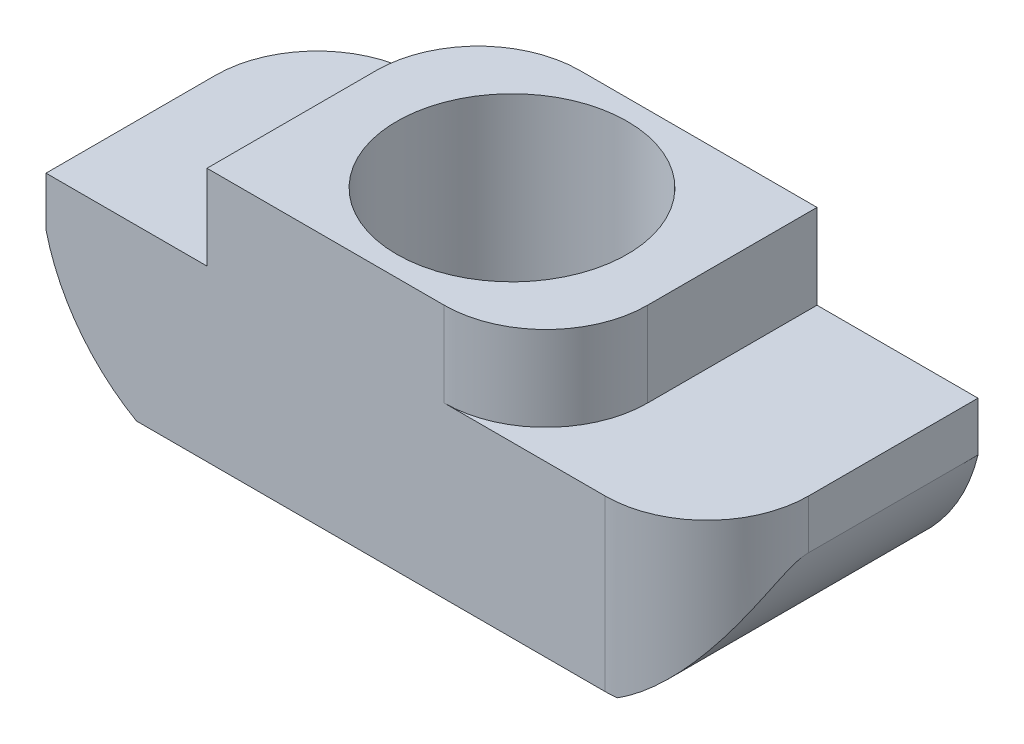
ISO-10303-21;
HEADER;
FILE_DESCRIPTION(('STEP AP214'),'2;1');
FILE_NAME('part.step','',(''),(''),'','','');
FILE_SCHEMA(('AUTOMOTIVE_DESIGN { 1 0 10303 214 1 1 1 1 }'));
ENDSEC;
DATA;
#1=APPLICATION_CONTEXT('core data for automotive mechanical design processes');
#2=APPLICATION_PROTOCOL_DEFINITION('international standard','automotive_design',2000,#1);
#3=PRODUCT_CONTEXT('',#1,'mechanical');
#4=PRODUCT('Part','Part','',(#3));
#5=PRODUCT_RELATED_PRODUCT_CATEGORY('part','',(#4));
#6=PRODUCT_DEFINITION_FORMATION('','',#4);
#7=PRODUCT_DEFINITION_CONTEXT('part definition',#1,'design');
#8=PRODUCT_DEFINITION('design','',#6,#7);
#9=PRODUCT_DEFINITION_SHAPE('','',#8);
#10=(LENGTH_UNIT() NAMED_UNIT(*) SI_UNIT(.MILLI.,.METRE.));
#11=(NAMED_UNIT(*) PLANE_ANGLE_UNIT() SI_UNIT($,.RADIAN.));
#12=(NAMED_UNIT(*) SI_UNIT($,.STERADIAN.) SOLID_ANGLE_UNIT());
#13=UNCERTAINTY_MEASURE_WITH_UNIT(LENGTH_MEASURE(1.E-05),#10,'distance_accuracy_value','');
#14=(GEOMETRIC_REPRESENTATION_CONTEXT(3) GLOBAL_UNCERTAINTY_ASSIGNED_CONTEXT((#13)) GLOBAL_UNIT_ASSIGNED_CONTEXT((#10,
#11,#12)) REPRESENTATION_CONTEXT('',''));
#15=CARTESIAN_POINT('',(0.,0.,0.));
#16=DIRECTION('',(0.,0.,1.));
#17=DIRECTION('',(1.,0.,0.));
#18=AXIS2_PLACEMENT_3D('',#15,#16,#17);
#19=CARTESIAN_POINT('',(19.5,0.,4.));
#20=DIRECTION('',(0.,-1.,0.));
#21=DIRECTION('',(0.,0.,-1.));
#22=AXIS2_PLACEMENT_3D('',#19,#20,#21);
#23=PLANE('',#22);
#24=DIRECTION('',(-1.,0.,0.));
#25=VECTOR('',#24,1.);
#26=CARTESIAN_POINT('',(19.5,0.,4.));
#27=LINE('',#26,#25);
#28=CARTESIAN_POINT('',(16.5,0.,4.));
#29=VERTEX_POINT('',#28);
#30=CARTESIAN_POINT('',(11.75,0.,4.));
#31=VERTEX_POINT('',#30);
#32=EDGE_CURVE('E174',#29,#31,#27,.T.);
#33=ORIENTED_EDGE('',*,*,#32,.F.);
#34=CARTESIAN_POINT('',(16.5,0.,1.));
#35=DIRECTION('',(0.,-1.,0.));
#36=DIRECTION('',(0.,0.,-1.));
#37=AXIS2_PLACEMENT_3D('',#34,#35,#36);
#38=CIRCLE('',#37,3.);
#39=CARTESIAN_POINT('',(19.5,0.,1.));
#40=VERTEX_POINT('',#39);
#41=EDGE_CURVE('E221',#29,#40,#38,.F.);
#42=ORIENTED_EDGE('',*,*,#41,.T.);
#43=DIRECTION('',(0.,0.,-1.));
#44=VECTOR('',#43,1.);
#45=CARTESIAN_POINT('',(19.5,0.,4.));
#46=LINE('',#45,#44);
#47=CARTESIAN_POINT('',(19.5,0.,-4.));
#48=VERTEX_POINT('',#47);
#49=EDGE_CURVE('E213',#40,#48,#46,.T.);
#50=ORIENTED_EDGE('',*,*,#49,.T.);
#51=DIRECTION('',(-1.,0.,0.));
#52=VECTOR('',#51,1.);
#53=CARTESIAN_POINT('',(19.5,0.,-4.));
#54=LINE('',#53,#52);
#55=CARTESIAN_POINT('',(14.75,0.,-4.));
#56=VERTEX_POINT('',#55);
#57=EDGE_CURVE('E191',#48,#56,#54,.T.);
#58=ORIENTED_EDGE('',*,*,#57,.T.);
#59=DIRECTION('',(0.,0.,-1.));
#60=VECTOR('',#59,1.);
#61=CARTESIAN_POINT('',(14.75,0.,4.));
#62=LINE('',#61,#60);
#63=CARTESIAN_POINT('',(14.75,0.,1.));
#64=VERTEX_POINT('',#63);
#65=EDGE_CURVE('E159',#64,#56,#62,.T.);
#66=ORIENTED_EDGE('',*,*,#65,.F.);
#67=CARTESIAN_POINT('',(11.75,0.,1.));
#68=DIRECTION('',(0.,-1.,0.));
#69=DIRECTION('',(0.,0.,-1.));
#70=AXIS2_PLACEMENT_3D('',#67,#68,#69);
#71=CIRCLE('',#70,3.);
#72=EDGE_CURVE('E11',#64,#31,#71,.T.);
#73=ORIENTED_EDGE('',*,*,#72,.T.);
#74=EDGE_LOOP('',(#33,#42,#50,#58,#66,#73));
#75=FACE_BOUND('',#74,.T.);
#76=ADVANCED_FACE('F37',(#75),#23,.F.);
#77=CARTESIAN_POINT('',(14.0298199735039,-0.116561355821887,4.));
#78=DIRECTION('',(0.,0.,-1.));
#79=DIRECTION('',(-1.,0.,0.));
#80=AXIS2_PLACEMENT_3D('',#77,#78,#79);
#81=CYLINDRICAL_SURFACE('',#80,5.63035772753956);
#82=DIRECTION('',(0.,0.,-1.));
#83=VECTOR('',#82,1.);
#84=CARTESIAN_POINT('',(19.5,-1.45000000000039,4.));
#85=LINE('',#84,#83);
#86=CARTESIAN_POINT('',(19.5,-1.45000000000039,1.));
#87=VERTEX_POINT('',#86);
#88=CARTESIAN_POINT('',(19.5,-1.45000000000039,-4.));
#89=VERTEX_POINT('',#88);
#90=EDGE_CURVE('E214',#87,#89,#85,.T.);
#91=ORIENTED_EDGE('',*,*,#90,.F.);
#92=CARTESIAN_POINT('',(19.5,-1.45000000000039,1.));
#93=CARTESIAN_POINT('',(19.500030686261,-1.4498111668862,1.04693113961448));
#94=CARTESIAN_POINT('',(19.4989008748738,-1.45451565676387,1.09355041233791));
#95=CARTESIAN_POINT('',(19.4946614752903,-1.47175612192233,1.18432227872229));
#96=CARTESIAN_POINT('',(19.4915911671988,-1.48413662469354,1.2285053234185));
#97=CARTESIAN_POINT('',(19.4818630221744,-1.52250486010755,1.33570161318846));
#98=CARTESIAN_POINT('',(19.4741823269534,-1.55219298964481,1.39723987940419));
#99=CARTESIAN_POINT('',(19.4559377960907,-1.6197005263675,1.51581857331209));
#100=CARTESIAN_POINT('',(19.4453430225768,-1.65760620601677,1.57280174920294));
#101=CARTESIAN_POINT('',(19.4154185370227,-1.75984903894833,1.71266471960721));
#102=CARTESIAN_POINT('',(19.394468236005,-1.82736935038901,1.79282283236082));
#103=CARTESIAN_POINT('',(19.3477296290429,-1.96758845045159,1.9470517449128));
#104=CARTESIAN_POINT('',(19.321930299781,-2.04029879930096,2.02110811068703));
#105=CARTESIAN_POINT('',(19.2656774879802,-2.18852231645763,2.16490177301905));
#106=CARTESIAN_POINT('',(19.2352123460466,-2.26404213713742,2.23462761690336));
#107=CARTESIAN_POINT('',(19.1697765161467,-2.41626714157724,2.37038589943578));
#108=CARTESIAN_POINT('',(19.1348099971093,-2.49297117145199,2.4364216754697));
#109=CARTESIAN_POINT('',(19.038787730797,-2.69131277351255,2.60261644498468));
#110=CARTESIAN_POINT('',(18.9743356107838,-2.81329192972719,2.70043290135421));
#111=CARTESIAN_POINT('',(18.8337922860608,-3.05638072960824,2.88870433575345));
#112=CARTESIAN_POINT('',(18.7576925845433,-3.17748967038499,2.9791538652716));
#113=CARTESIAN_POINT('',(18.5937252958082,-3.41696746502812,3.15184632752966));
#114=CARTESIAN_POINT('',(18.5058913712186,-3.5353430612335,3.23411160280687));
#115=CARTESIAN_POINT('',(18.3179787697195,-3.76828045825097,3.38952518556181));
#116=CARTESIAN_POINT('',(18.2179000631834,-3.88284224983459,3.46267347097988));
#117=CARTESIAN_POINT('',(17.9684441123965,-4.14535283699644,3.62152547962739));
#118=CARTESIAN_POINT('',(17.8139503752863,-4.29123162671201,3.70289356886931));
#119=CARTESIAN_POINT('',(17.5659046624691,-4.49933263410756,3.80567783264862));
#120=CARTESIAN_POINT('',(17.4806223290737,-4.56683549638431,3.83670106619056));
#121=CARTESIAN_POINT('',(17.3047910780072,-4.69777014812869,3.89150100613183));
#122=CARTESIAN_POINT('',(17.214246058542,-4.76120487951418,3.91528299685313));
#123=CARTESIAN_POINT('',(17.0742929840335,-4.85315107391569,3.94491055018588));
#124=CARTESIAN_POINT('',(17.0266679387778,-4.88342943422888,3.95381207645931));
#125=CARTESIAN_POINT('',(16.9302531713818,-4.94270049327175,3.96938824057382));
#126=CARTESIAN_POINT('',(16.8814631834848,-4.97169289424224,3.97606236497805));
#127=CARTESIAN_POINT('',(16.8321324379895,-5.00000000000008,3.98155798931283));
#128=B_SPLINE_CURVE_WITH_KNOTS('',3,(#92,#93,#94,#95,#96,#97,#98,#99,#100,#101,#102,#103,#104,
#105,#106,#107,#108,#109,#110,#111,#112,#113,#114,#115,#116,#117,#118,#119,#120,#121,#122,#123,
#124,#125,#126,#127),.UNSPECIFIED.,.F.,.F.,(4,2,2,2,2,2,2,2,2,2,2,2,2,2,2,2,2,4),(0.,
0.14004913545591,0.277350370618835,0.482449888006828,0.689817040281661,1.00968140682414,
1.33028191562641,1.65169705395345,1.9728166283852,2.47957572173093,2.98670626896699,
3.49241202976559,3.99811901415644,4.67777084491336,5.01674786569463,5.35547692065932,
5.52681477743732,5.69819210194936),.UNSPECIFIED.);
#129=CARTESIAN_POINT('',(16.8321324379895,-5.,3.98155798931283));
#130=VERTEX_POINT('',#129);
#131=EDGE_CURVE('E445',#87,#130,#128,.T.);
#132=ORIENTED_EDGE('',*,*,#131,.T.);
#133=DIRECTION('',(0.,0.,-1.));
#134=VECTOR('',#133,1.);
#135=CARTESIAN_POINT('',(16.8321324379895,-5.,4.));
#136=LINE('',#135,#134);
#137=CARTESIAN_POINT('',(16.8321324379895,-5.,-4.));
#138=VERTEX_POINT('',#137);
#139=EDGE_CURVE('E200',#130,#138,#136,.T.);
#140=ORIENTED_EDGE('',*,*,#139,.T.);
#141=CARTESIAN_POINT('',(14.0298199735039,-0.116561355821887,-4.));
#142=DIRECTION('',(0.,0.,1.));
#143=DIRECTION('',(1.,0.,0.));
#144=AXIS2_PLACEMENT_3D('',#141,#142,#143);
#145=CIRCLE('',#144,5.63035772753956);
#146=EDGE_CURVE('E463',#138,#89,#145,.T.);
#147=ORIENTED_EDGE('',*,*,#146,.T.);
#148=EDGE_LOOP('',(#91,#132,#140,#147));
#149=FACE_BOUND('',#148,.T.);
#150=ADVANCED_FACE('F254',(#149),#81,.T.);
#151=CARTESIAN_POINT('',(19.5,0.,4.));
#152=DIRECTION('',(-1.,0.,0.));
#153=DIRECTION('',(0.,0.,1.));
#154=AXIS2_PLACEMENT_3D('',#151,#152,#153);
#155=PLANE('',#154);
#156=ORIENTED_EDGE('',*,*,#49,.F.);
#157=DIRECTION('',(0.,1.,0.));
#158=VECTOR('',#157,1.);
#159=CARTESIAN_POINT('',(19.5,-1.45000000000039,1.));
#160=LINE('',#159,#158);
#161=EDGE_CURVE('E224',#40,#87,#160,.F.);
#162=ORIENTED_EDGE('',*,*,#161,.T.);
#163=ORIENTED_EDGE('',*,*,#90,.T.);
#164=DIRECTION('',(0.,1.,0.));
#165=VECTOR('',#164,1.);
#166=CARTESIAN_POINT('',(19.5,0.,-4.));
#167=LINE('',#166,#165);
#168=EDGE_CURVE('E192',#89,#48,#167,.T.);
#169=ORIENTED_EDGE('',*,*,#168,.T.);
#170=EDGE_LOOP('',(#156,#162,#163,#169));
#171=FACE_BOUND('',#170,.T.);
#172=ADVANCED_FACE('F261',(#171),#155,.F.);
#173=CARTESIAN_POINT('',(7.74999999999999,0.,-4.));
#174=VERTEX_POINT('',#173);
#175=CARTESIAN_POINT('',(3.,0.,-4.));
#176=VERTEX_POINT('',#175);
#177=EDGE_CURVE('E187',#174,#176,#54,.T.);
#178=ORIENTED_EDGE('',*,*,#177,.T.);
#179=CARTESIAN_POINT('',(3.,0.,-1.));
#180=DIRECTION('',(0.,-1.,0.));
#181=DIRECTION('',(0.,0.,-1.));
#182=AXIS2_PLACEMENT_3D('',#179,#180,#181);
#183=CIRCLE('',#182,3.);
#184=CARTESIAN_POINT('',(0.,0.,-1.));
#185=VERTEX_POINT('',#184);
#186=EDGE_CURVE('E278',#176,#185,#183,.F.);
#187=ORIENTED_EDGE('',*,*,#186,.T.);
#188=DIRECTION('',(0.,0.,-1.));
#189=VECTOR('',#188,1.);
#190=CARTESIAN_POINT('',(0.,0.,4.));
#191=LINE('',#190,#189);
#192=CARTESIAN_POINT('',(0.,0.,4.));
#193=VERTEX_POINT('',#192);
#194=EDGE_CURVE('E210',#193,#185,#191,.T.);
#195=ORIENTED_EDGE('',*,*,#194,.F.);
#196=CARTESIAN_POINT('',(4.74999999999999,0.,4.));
#197=VERTEX_POINT('',#196);
#198=EDGE_CURVE('E178',#197,#193,#27,.T.);
#199=ORIENTED_EDGE('',*,*,#198,.F.);
#200=DIRECTION('',(0.,0.,-1.));
#201=VECTOR('',#200,1.);
#202=CARTESIAN_POINT('',(4.74999999999999,0.,4.));
#203=LINE('',#202,#201);
#204=CARTESIAN_POINT('',(4.74999999999999,0.,-1.));
#205=VERTEX_POINT('',#204);
#206=EDGE_CURVE('E154',#197,#205,#203,.T.);
#207=ORIENTED_EDGE('',*,*,#206,.T.);
#208=CARTESIAN_POINT('',(7.74999999999999,0.,-1.));
#209=DIRECTION('',(0.,-1.,0.));
#210=DIRECTION('',(0.,0.,-1.));
#211=AXIS2_PLACEMENT_3D('',#208,#209,#210);
#212=CIRCLE('',#211,3.);
#213=EDGE_CURVE('E45',#205,#174,#212,.T.);
#214=ORIENTED_EDGE('',*,*,#213,.T.);
#215=EDGE_LOOP('',(#178,#187,#195,#199,#207,#214));
#216=FACE_BOUND('',#215,.T.);
#217=ADVANCED_FACE('F257',(#216),#23,.F.);
#218=CARTESIAN_POINT('',(0.,0.,4.));
#219=DIRECTION('',(1.,0.,0.));
#220=DIRECTION('',(0.,0.,-1.));
#221=AXIS2_PLACEMENT_3D('',#218,#219,#220);
#222=PLANE('',#221);
#223=ORIENTED_EDGE('',*,*,#194,.T.);
#224=DIRECTION('',(0.,-1.,0.));
#225=VECTOR('',#224,1.);
#226=CARTESIAN_POINT('',(0.,0.,-1.));
#227=LINE('',#226,#225);
#228=CARTESIAN_POINT('',(0.,-1.45000000000036,-1.));
#229=VERTEX_POINT('',#228);
#230=EDGE_CURVE('E288',#185,#229,#227,.T.);
#231=ORIENTED_EDGE('',*,*,#230,.T.);
#232=DIRECTION('',(0.,0.,-1.));
#233=VECTOR('',#232,1.);
#234=CARTESIAN_POINT('',(0.,-1.45000000000036,4.));
#235=LINE('',#234,#233);
#236=CARTESIAN_POINT('',(0.,-1.45000000000036,4.));
#237=VERTEX_POINT('',#236);
#238=EDGE_CURVE('E207',#237,#229,#235,.T.);
#239=ORIENTED_EDGE('',*,*,#238,.F.);
#240=DIRECTION('',(0.,-1.,0.));
#241=VECTOR('',#240,1.);
#242=CARTESIAN_POINT('',(0.,0.,4.));
#243=LINE('',#242,#241);
#244=EDGE_CURVE('E177',#193,#237,#243,.T.);
#245=ORIENTED_EDGE('',*,*,#244,.F.);
#246=EDGE_LOOP('',(#223,#231,#239,#245));
#247=FACE_BOUND('',#246,.T.);
#248=ADVANCED_FACE('F267',(#247),#222,.F.);
#249=CARTESIAN_POINT('',(5.47018002649611,-0.116561355821887,4.));
#250=DIRECTION('',(0.,0.,-1.));
#251=DIRECTION('',(-1.,0.,0.));
#252=AXIS2_PLACEMENT_3D('',#249,#250,#251);
#253=CYLINDRICAL_SURFACE('',#252,5.63035772753956);
#254=ORIENTED_EDGE('',*,*,#238,.T.);
#255=CARTESIAN_POINT('',(0.,-1.45000000000036,-1.));
#256=CARTESIAN_POINT('',(-3.06862610184169E-05,-1.44981116688619,-1.04693113961448));
#257=CARTESIAN_POINT('',(0.00109912512615359,-1.45451565676387,-1.09355041233791));
#258=CARTESIAN_POINT('',(0.00533852470970577,-1.47175612192234,-1.18432227872228));
#259=CARTESIAN_POINT('',(0.00840883280124228,-1.48413662469355,-1.2285053234185));
#260=CARTESIAN_POINT('',(0.018136977825628,-1.52250486010755,-1.33570161318846));
#261=CARTESIAN_POINT('',(0.0258176730466393,-1.55219298964482,-1.39723987940419));
#262=CARTESIAN_POINT('',(0.0440622039092718,-1.61970052636751,-1.51581857331209));
#263=CARTESIAN_POINT('',(0.0546569774231719,-1.65760620601677,-1.57280174920294));
#264=CARTESIAN_POINT('',(0.0845814629773055,-1.75984903894833,-1.71266471960722));
#265=CARTESIAN_POINT('',(0.105531763995019,-1.82736935038901,-1.79282283236082));
#266=CARTESIAN_POINT('',(0.152270370957117,-1.96758845045159,-1.9470517449128));
#267=CARTESIAN_POINT('',(0.178069700218957,-2.04029879930096,-2.02110811068703));
#268=CARTESIAN_POINT('',(0.234322512019822,-2.18852231645763,-2.16490177301905));
#269=CARTESIAN_POINT('',(0.264787653953365,-2.26404213713742,-2.23462761690336));
#270=CARTESIAN_POINT('',(0.330223483853336,-2.41626714157724,-2.37038589943577));
#271=CARTESIAN_POINT('',(0.365190002890695,-2.49297117145199,-2.43642167546971));
#272=CARTESIAN_POINT('',(0.461212269203003,-2.69131277351256,-2.60261644498469));
#273=CARTESIAN_POINT('',(0.525664389216205,-2.81329192972719,-2.70043290135421));
#274=CARTESIAN_POINT('',(0.666207713939191,-3.05638072960824,-2.88870433575345));
#275=CARTESIAN_POINT('',(0.742307415456681,-3.17748967038499,-2.9791538652716));
#276=CARTESIAN_POINT('',(0.906274704191821,-3.41696746502812,-3.15184632752966));
#277=CARTESIAN_POINT('',(0.994108628781453,-3.53534306123351,-3.23411160280687));
#278=CARTESIAN_POINT('',(1.18202123028054,-3.76828045825097,-3.38952518556181));
#279=CARTESIAN_POINT('',(1.28209993681657,-3.88284224983459,-3.46267347097988));
#280=CARTESIAN_POINT('',(1.53155588760348,-4.14535283699644,-3.62152547962739));
#281=CARTESIAN_POINT('',(1.68604962471373,-4.29123162671201,-3.70289356886931));
#282=CARTESIAN_POINT('',(1.93409533753088,-4.49933263410756,-3.80567783264862));
#283=CARTESIAN_POINT('',(2.01937767092626,-4.56683549638431,-3.83670106619056));
#284=CARTESIAN_POINT('',(2.1952089219928,-4.69777014812869,-3.89150100613183));
#285=CARTESIAN_POINT('',(2.28575394145803,-4.76120487951417,-3.91528299685313));
#286=CARTESIAN_POINT('',(2.42570701596649,-4.85315107391569,-3.94491055018588));
#287=CARTESIAN_POINT('',(2.47333206122223,-4.88342943422888,-3.95381207645931));
#288=CARTESIAN_POINT('',(2.56974682861824,-4.94270049327176,-3.96938824057382));
#289=CARTESIAN_POINT('',(2.61853681651518,-4.97169289424224,-3.97606236497805));
#290=CARTESIAN_POINT('',(2.66786756201049,-5.00000000000008,-3.98155798931283));
#291=B_SPLINE_CURVE_WITH_KNOTS('',3,(#255,#256,#257,#258,#259,#260,#261,#262,#263,#264,#265,
#266,#267,#268,#269,#270,#271,#272,#273,#274,#275,#276,#277,#278,#279,#280,#281,#282,#283,#284,
#285,#286,#287,#288,#289,#290),.UNSPECIFIED.,.F.,.F.,(4,2,2,2,2,2,2,2,2,2,2,2,2,2,2,2,2,4),(0.,
0.140049135455911,0.277350370618839,0.482449888006833,0.689817040281665,1.00968140682414,
1.33028191562641,1.65169705395345,1.9728166283852,2.47957572173093,2.98670626896699,
3.4924120297656,3.99811901415644,4.67777084491336,5.01674786569463,5.35547692065932,
5.52681477743732,5.69819210194936),.UNSPECIFIED.);
#292=CARTESIAN_POINT('',(2.66786756201054,-5.,-3.98155798931283));
#293=VERTEX_POINT('',#292);
#294=EDGE_CURVE('E322',#229,#293,#291,.T.);
#295=ORIENTED_EDGE('',*,*,#294,.T.);
#296=DIRECTION('',(0.,0.,-1.));
#297=VECTOR('',#296,1.);
#298=CARTESIAN_POINT('',(2.66786756201054,-5.,4.));
#299=LINE('',#298,#297);
#300=CARTESIAN_POINT('',(2.66786756201054,-5.,4.));
#301=VERTEX_POINT('',#300);
#302=EDGE_CURVE('E203',#301,#293,#299,.T.);
#303=ORIENTED_EDGE('',*,*,#302,.F.);
#304=CARTESIAN_POINT('',(5.47018002649611,-0.116561355821887,4.));
#305=DIRECTION('',(0.,0.,1.));
#306=DIRECTION('',(1.,0.,0.));
#307=AXIS2_PLACEMENT_3D('',#304,#305,#306);
#308=CIRCLE('',#307,5.63035772753956);
#309=EDGE_CURVE('E461',#237,#301,#308,.T.);
#310=ORIENTED_EDGE('',*,*,#309,.F.);
#311=EDGE_LOOP('',(#254,#295,#303,#310));
#312=FACE_BOUND('',#311,.T.);
#313=ADVANCED_FACE('F273',(#312),#253,.T.);
#314=CARTESIAN_POINT('',(16.8321324379895,-5.,4.));
#315=DIRECTION('',(0.,1.,0.));
#316=DIRECTION('',(0.,0.,1.));
#317=AXIS2_PLACEMENT_3D('',#314,#315,#316);
#318=PLANE('',#317);
#319=CARTESIAN_POINT('',(9.75,-5.,0.));
#320=DIRECTION('',(0.,1.,0.));
#321=DIRECTION('',(0.,0.,1.));
#322=AXIS2_PLACEMENT_3D('',#319,#320,#321);
#323=CIRCLE('',#322,3.39999999999999);
#324=CARTESIAN_POINT('',(9.75,-5.,3.39999999999999));
#325=VERTEX_POINT('',#324);
#326=EDGE_CURVE('E171',#325,#325,#323,.T.);
#327=ORIENTED_EDGE('',*,*,#326,.T.);
#328=EDGE_LOOP('',(#327));
#329=FACE_BOUND('',#328,.T.);
#330=ORIENTED_EDGE('',*,*,#139,.F.);
#331=CARTESIAN_POINT('',(16.5,-5.,1.));
#332=DIRECTION('',(0.,1.,0.));
#333=DIRECTION('',(0.,0.,1.));
#334=AXIS2_PLACEMENT_3D('',#331,#332,#333);
#335=CIRCLE('',#334,3.);
#336=CARTESIAN_POINT('',(16.5,-5.,4.));
#337=VERTEX_POINT('',#336);
#338=EDGE_CURVE('E446',#130,#337,#335,.F.);
#339=ORIENTED_EDGE('',*,*,#338,.T.);
#340=DIRECTION('',(1.,0.,0.));
#341=VECTOR('',#340,1.);
#342=CARTESIAN_POINT('',(16.8321324379895,-5.,4.));
#343=LINE('',#342,#341);
#344=EDGE_CURVE('E204',#301,#337,#343,.T.);
#345=ORIENTED_EDGE('',*,*,#344,.F.);
#346=ORIENTED_EDGE('',*,*,#302,.T.);
#347=CARTESIAN_POINT('',(3.,-5.,-1.));
#348=DIRECTION('',(0.,1.,0.));
#349=DIRECTION('',(0.,0.,1.));
#350=AXIS2_PLACEMENT_3D('',#347,#348,#349);
#351=CIRCLE('',#350,3.);
#352=CARTESIAN_POINT('',(3.,-5.,-4.));
#353=VERTEX_POINT('',#352);
#354=EDGE_CURVE('E448',#293,#353,#351,.F.);
#355=ORIENTED_EDGE('',*,*,#354,.T.);
#356=DIRECTION('',(1.,0.,0.));
#357=VECTOR('',#356,1.);
#358=CARTESIAN_POINT('',(16.8321324379895,-5.,-4.));
#359=LINE('',#358,#357);
#360=EDGE_CURVE('E186',#353,#138,#359,.T.);
#361=ORIENTED_EDGE('',*,*,#360,.T.);
#362=EDGE_LOOP('',(#330,#339,#345,#346,#355,#361));
#363=FACE_BOUND('',#362,.T.);
#364=ADVANCED_FACE('F332',(#329,#363),#318,.F.);
#365=CARTESIAN_POINT('',(14.0298199735039,-0.116561355821887,4.));
#366=DIRECTION('',(0.,0.,1.));
#367=DIRECTION('',(1.,0.,0.));
#368=AXIS2_PLACEMENT_3D('',#365,#366,#367);
#369=PLANE('',#368);
#370=ORIENTED_EDGE('',*,*,#344,.T.);
#371=DIRECTION('',(0.,1.,0.));
#372=VECTOR('',#371,1.);
#373=CARTESIAN_POINT('',(16.5,0.,4.));
#374=LINE('',#373,#372);
#375=EDGE_CURVE('E219',#337,#29,#374,.T.);
#376=ORIENTED_EDGE('',*,*,#375,.T.);
#377=ORIENTED_EDGE('',*,*,#32,.T.);
#378=DIRECTION('',(0.,1.,0.));
#379=VECTOR('',#378,1.);
#380=CARTESIAN_POINT('',(11.75,2.5,4.));
#381=LINE('',#380,#379);
#382=CARTESIAN_POINT('',(11.75,2.5,4.));
#383=VERTEX_POINT('',#382);
#384=EDGE_CURVE('E145',#31,#383,#381,.T.);
#385=ORIENTED_EDGE('',*,*,#384,.T.);
#386=DIRECTION('',(-1.,0.,0.));
#387=VECTOR('',#386,1.);
#388=CARTESIAN_POINT('',(14.75,2.5,4.));
#389=LINE('',#388,#387);
#390=CARTESIAN_POINT('',(4.74999999999999,2.5,4.));
#391=VERTEX_POINT('',#390);
#392=EDGE_CURVE('E138',#383,#391,#389,.T.);
#393=ORIENTED_EDGE('',*,*,#392,.T.);
#394=DIRECTION('',(0.,-1.,0.));
#395=VECTOR('',#394,1.);
#396=CARTESIAN_POINT('',(4.74999999999999,0.,4.));
#397=LINE('',#396,#395);
#398=EDGE_CURVE('E142',#391,#197,#397,.T.);
#399=ORIENTED_EDGE('',*,*,#398,.T.);
#400=ORIENTED_EDGE('',*,*,#198,.T.);
#401=ORIENTED_EDGE('',*,*,#244,.T.);
#402=ORIENTED_EDGE('',*,*,#309,.T.);
#403=EDGE_LOOP('',(#370,#376,#377,#385,#393,#399,#400,#401,#402));
#404=FACE_BOUND('',#403,.T.);
#405=ADVANCED_FACE('F140',(#404),#369,.T.);
#406=CARTESIAN_POINT('',(14.0298199735039,-0.116561355821887,-4.));
#407=DIRECTION('',(0.,0.,1.));
#408=DIRECTION('',(1.,0.,0.));
#409=AXIS2_PLACEMENT_3D('',#406,#407,#408);
#410=PLANE('',#409);
#411=ORIENTED_EDGE('',*,*,#360,.F.);
#412=DIRECTION('',(0.,-1.,0.));
#413=VECTOR('',#412,1.);
#414=CARTESIAN_POINT('',(3.,-0.116561355821887,-4.));
#415=LINE('',#414,#413);
#416=EDGE_CURVE('E286',#353,#176,#415,.F.);
#417=ORIENTED_EDGE('',*,*,#416,.T.);
#418=ORIENTED_EDGE('',*,*,#177,.F.);
#419=DIRECTION('',(0.,-1.,0.));
#420=VECTOR('',#419,1.);
#421=CARTESIAN_POINT('',(7.74999999999999,-0.116561355821887,-4.));
#422=LINE('',#421,#420);
#423=CARTESIAN_POINT('',(7.74999999999999,2.5,-4.));
#424=VERTEX_POINT('',#423);
#425=EDGE_CURVE('E292',#174,#424,#422,.F.);
#426=ORIENTED_EDGE('',*,*,#425,.T.);
#427=DIRECTION('',(-1.,0.,0.));
#428=VECTOR('',#427,1.);
#429=CARTESIAN_POINT('',(14.75,2.5,-4.));
#430=LINE('',#429,#428);
#431=CARTESIAN_POINT('',(14.75,2.5,-4.));
#432=VERTEX_POINT('',#431);
#433=EDGE_CURVE('E146',#432,#424,#430,.T.);
#434=ORIENTED_EDGE('',*,*,#433,.F.);
#435=DIRECTION('',(0.,1.,0.));
#436=VECTOR('',#435,1.);
#437=CARTESIAN_POINT('',(14.75,0.,-4.));
#438=LINE('',#437,#436);
#439=EDGE_CURVE('E168',#56,#432,#438,.T.);
#440=ORIENTED_EDGE('',*,*,#439,.F.);
#441=ORIENTED_EDGE('',*,*,#57,.F.);
#442=ORIENTED_EDGE('',*,*,#168,.F.);
#443=ORIENTED_EDGE('',*,*,#146,.F.);
#444=EDGE_LOOP('',(#411,#417,#418,#426,#434,#440,#441,#442,#443));
#445=FACE_BOUND('',#444,.T.);
#446=ADVANCED_FACE('F250',(#445),#410,.F.);
#447=CARTESIAN_POINT('',(14.75,0.,4.));
#448=DIRECTION('',(-1.,0.,0.));
#449=DIRECTION('',(0.,0.,1.));
#450=AXIS2_PLACEMENT_3D('',#447,#448,#449);
#451=PLANE('',#450);
#452=DIRECTION('',(0.,0.,-1.));
#453=VECTOR('',#452,1.);
#454=CARTESIAN_POINT('',(14.75,2.5,4.));
#455=LINE('',#454,#453);
#456=CARTESIAN_POINT('',(14.75,2.5,1.));
#457=VERTEX_POINT('',#456);
#458=EDGE_CURVE('E153',#457,#432,#455,.T.);
#459=ORIENTED_EDGE('',*,*,#458,.F.);
#460=DIRECTION('',(0.,1.,0.));
#461=VECTOR('',#460,1.);
#462=CARTESIAN_POINT('',(14.75,0.,1.));
#463=LINE('',#462,#461);
#464=EDGE_CURVE('E298',#457,#64,#463,.F.);
#465=ORIENTED_EDGE('',*,*,#464,.T.);
#466=ORIENTED_EDGE('',*,*,#65,.T.);
#467=ORIENTED_EDGE('',*,*,#439,.T.);
#468=EDGE_LOOP('',(#459,#465,#466,#467));
#469=FACE_BOUND('',#468,.T.);
#470=ADVANCED_FACE('F242',(#469),#451,.F.);
#471=CARTESIAN_POINT('',(14.75,2.5,4.));
#472=DIRECTION('',(0.,-1.,0.));
#473=DIRECTION('',(0.,0.,-1.));
#474=AXIS2_PLACEMENT_3D('',#471,#472,#473);
#475=PLANE('',#474);
#476=CARTESIAN_POINT('',(9.75,2.5,0.));
#477=DIRECTION('',(0.,1.,0.));
#478=DIRECTION('',(0.,0.,1.));
#479=AXIS2_PLACEMENT_3D('',#476,#477,#478);
#480=CIRCLE('',#479,3.39999999999999);
#481=CARTESIAN_POINT('',(9.75,2.5,3.39999999999999));
#482=VERTEX_POINT('',#481);
#483=EDGE_CURVE('E234',#482,#482,#480,.T.);
#484=ORIENTED_EDGE('',*,*,#483,.F.);
#485=EDGE_LOOP('',(#484));
#486=FACE_BOUND('',#485,.T.);
#487=ORIENTED_EDGE('',*,*,#433,.T.);
#488=CARTESIAN_POINT('',(7.74999999999999,2.5,-1.));
#489=DIRECTION('',(0.,-1.,0.));
#490=DIRECTION('',(0.,0.,-1.));
#491=AXIS2_PLACEMENT_3D('',#488,#489,#490);
#492=CIRCLE('',#491,3.);
#493=CARTESIAN_POINT('',(4.74999999999999,2.5,-1.));
#494=VERTEX_POINT('',#493);
#495=EDGE_CURVE('E59',#424,#494,#492,.F.);
#496=ORIENTED_EDGE('',*,*,#495,.T.);
#497=DIRECTION('',(0.,0.,-1.));
#498=VECTOR('',#497,1.);
#499=CARTESIAN_POINT('',(4.74999999999999,2.5,4.));
#500=LINE('',#499,#498);
#501=EDGE_CURVE('E148',#391,#494,#500,.T.);
#502=ORIENTED_EDGE('',*,*,#501,.F.);
#503=ORIENTED_EDGE('',*,*,#392,.F.);
#504=CARTESIAN_POINT('',(11.75,2.5,1.));
#505=DIRECTION('',(0.,-1.,0.));
#506=DIRECTION('',(0.,0.,-1.));
#507=AXIS2_PLACEMENT_3D('',#504,#505,#506);
#508=CIRCLE('',#507,3.);
#509=EDGE_CURVE('E52',#383,#457,#508,.F.);
#510=ORIENTED_EDGE('',*,*,#509,.T.);
#511=ORIENTED_EDGE('',*,*,#458,.T.);
#512=EDGE_LOOP('',(#487,#496,#502,#503,#510,#511));
#513=FACE_BOUND('',#512,.T.);
#514=ADVANCED_FACE('F149',(#486,#513),#475,.F.);
#515=CARTESIAN_POINT('',(4.74999999999999,0.,4.));
#516=DIRECTION('',(1.,0.,0.));
#517=DIRECTION('',(0.,0.,-1.));
#518=AXIS2_PLACEMENT_3D('',#515,#516,#517);
#519=PLANE('',#518);
#520=ORIENTED_EDGE('',*,*,#501,.T.);
#521=DIRECTION('',(0.,-1.,0.));
#522=VECTOR('',#521,1.);
#523=CARTESIAN_POINT('',(4.74999999999999,0.,-1.));
#524=LINE('',#523,#522);
#525=EDGE_CURVE('E289',#494,#205,#524,.T.);
#526=ORIENTED_EDGE('',*,*,#525,.T.);
#527=ORIENTED_EDGE('',*,*,#206,.F.);
#528=ORIENTED_EDGE('',*,*,#398,.F.);
#529=EDGE_LOOP('',(#520,#526,#527,#528));
#530=FACE_BOUND('',#529,.T.);
#531=ADVANCED_FACE('F156',(#530),#519,.F.);
#532=CARTESIAN_POINT('',(16.5,-0.116561355821887,1.));
#533=DIRECTION('',(0.,-1.,0.));
#534=DIRECTION('',(0.,0.,-1.));
#535=AXIS2_PLACEMENT_3D('',#532,#533,#534);
#536=CYLINDRICAL_SURFACE('',#535,3.);
#537=ORIENTED_EDGE('',*,*,#131,.F.);
#538=ORIENTED_EDGE('',*,*,#161,.F.);
#539=ORIENTED_EDGE('',*,*,#41,.F.);
#540=ORIENTED_EDGE('',*,*,#375,.F.);
#541=ORIENTED_EDGE('',*,*,#338,.F.);
#542=EDGE_LOOP('',(#537,#538,#539,#540,#541));
#543=FACE_BOUND('',#542,.T.);
#544=ADVANCED_FACE('F248',(#543),#536,.T.);
#545=CARTESIAN_POINT('',(3.,0.,-1.));
#546=DIRECTION('',(0.,-1.,0.));
#547=DIRECTION('',(0.,0.,-1.));
#548=AXIS2_PLACEMENT_3D('',#545,#546,#547);
#549=CYLINDRICAL_SURFACE('',#548,3.);
#550=ORIENTED_EDGE('',*,*,#186,.F.);
#551=ORIENTED_EDGE('',*,*,#416,.F.);
#552=ORIENTED_EDGE('',*,*,#354,.F.);
#553=ORIENTED_EDGE('',*,*,#294,.F.);
#554=ORIENTED_EDGE('',*,*,#230,.F.);
#555=EDGE_LOOP('',(#550,#551,#552,#553,#554));
#556=FACE_BOUND('',#555,.T.);
#557=ADVANCED_FACE('F284',(#556),#549,.T.);
#558=CARTESIAN_POINT('',(7.74999999999999,0.,-1.));
#559=DIRECTION('',(0.,-1.,0.));
#560=DIRECTION('',(0.,0.,-1.));
#561=AXIS2_PLACEMENT_3D('',#558,#559,#560);
#562=CYLINDRICAL_SURFACE('',#561,3.);
#563=ORIENTED_EDGE('',*,*,#495,.F.);
#564=ORIENTED_EDGE('',*,*,#425,.F.);
#565=ORIENTED_EDGE('',*,*,#213,.F.);
#566=ORIENTED_EDGE('',*,*,#525,.F.);
#567=EDGE_LOOP('',(#563,#564,#565,#566));
#568=FACE_BOUND('',#567,.T.);
#569=ADVANCED_FACE('F307',(#568),#562,.T.);
#570=CARTESIAN_POINT('',(11.75,-0.116561355821887,1.));
#571=DIRECTION('',(0.,-1.,0.));
#572=DIRECTION('',(0.,0.,-1.));
#573=AXIS2_PLACEMENT_3D('',#570,#571,#572);
#574=CYLINDRICAL_SURFACE('',#573,3.);
#575=ORIENTED_EDGE('',*,*,#72,.F.);
#576=ORIENTED_EDGE('',*,*,#464,.F.);
#577=ORIENTED_EDGE('',*,*,#509,.F.);
#578=ORIENTED_EDGE('',*,*,#384,.F.);
#579=EDGE_LOOP('',(#575,#576,#577,#578));
#580=FACE_BOUND('',#579,.T.);
#581=ADVANCED_FACE('F39',(#580),#574,.T.);
#582=CARTESIAN_POINT('',(9.75,2.5,0.));
#583=DIRECTION('',(0.,1.,0.));
#584=DIRECTION('',(0.,0.,1.));
#585=AXIS2_PLACEMENT_3D('',#582,#583,#584);
#586=CYLINDRICAL_SURFACE('',#585,3.39999999999999);
#587=ORIENTED_EDGE('',*,*,#483,.T.);
#588=EDGE_LOOP('',(#587));
#589=FACE_BOUND('',#588,.T.);
#590=ORIENTED_EDGE('',*,*,#326,.F.);
#591=EDGE_LOOP('',(#590));
#592=FACE_BOUND('',#591,.T.);
#593=ADVANCED_FACE('F238',(#589,#592),#586,.F.);
#594=CLOSED_SHELL('',(#76,#150,#172,#217,#248,#313,#364,#405,#446,#470,#514,#531,#544,#557,#569,
#581,#593));
#595=MANIFOLD_SOLID_BREP('B2',#594);
#596=ADVANCED_BREP_SHAPE_REPRESENTATION('',(#18,#595),#14);
#597=SHAPE_DEFINITION_REPRESENTATION(#9,#596);
ENDSEC;
END-ISO-10303-21;
